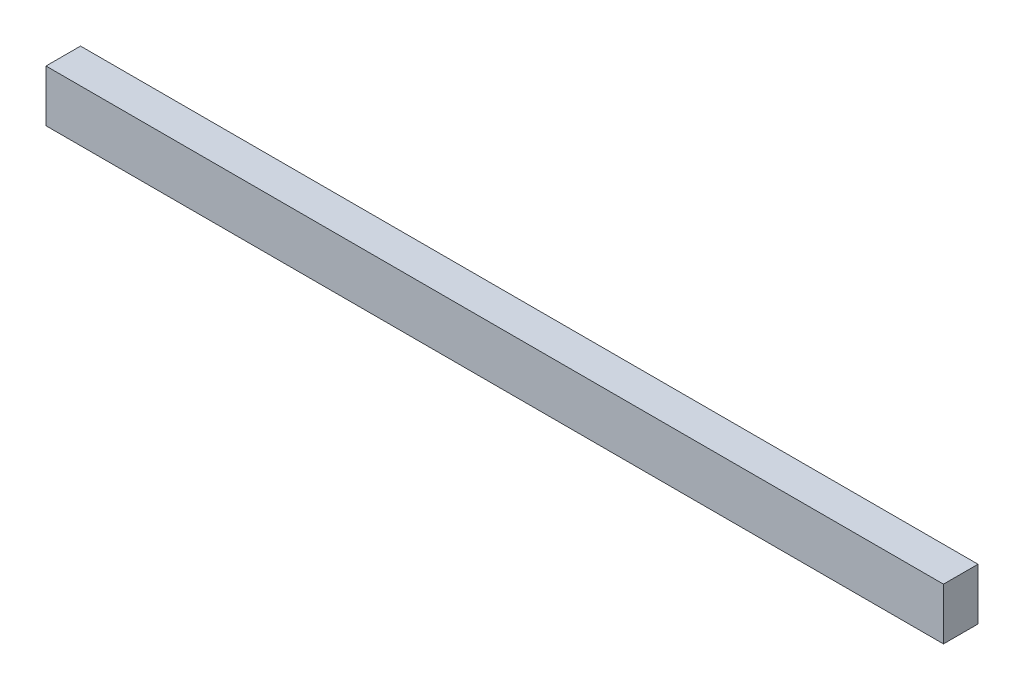
ISO-10303-21;
HEADER;
FILE_DESCRIPTION(('STEP AP214'),'2;1');
FILE_NAME('part.step','',(''),(''),'','','');
FILE_SCHEMA(('AUTOMOTIVE_DESIGN { 1 0 10303 214 1 1 1 1 }'));
ENDSEC;
DATA;
#1=APPLICATION_CONTEXT('core data for automotive mechanical design processes');
#2=APPLICATION_PROTOCOL_DEFINITION('international standard','automotive_design',2000,#1);
#3=PRODUCT_CONTEXT('',#1,'mechanical');
#4=PRODUCT('Part','Part','',(#3));
#5=PRODUCT_RELATED_PRODUCT_CATEGORY('part','',(#4));
#6=PRODUCT_DEFINITION_FORMATION('','',#4);
#7=PRODUCT_DEFINITION_CONTEXT('part definition',#1,'design');
#8=PRODUCT_DEFINITION('design','',#6,#7);
#9=PRODUCT_DEFINITION_SHAPE('','',#8);
#10=(LENGTH_UNIT() NAMED_UNIT(*) SI_UNIT(.MILLI.,.METRE.));
#11=(NAMED_UNIT(*) PLANE_ANGLE_UNIT() SI_UNIT($,.RADIAN.));
#12=(NAMED_UNIT(*) SI_UNIT($,.STERADIAN.) SOLID_ANGLE_UNIT());
#13=UNCERTAINTY_MEASURE_WITH_UNIT(LENGTH_MEASURE(1.E-05),#10,'distance_accuracy_value','');
#14=(GEOMETRIC_REPRESENTATION_CONTEXT(3) GLOBAL_UNCERTAINTY_ASSIGNED_CONTEXT((#13)) GLOBAL_UNIT_ASSIGNED_CONTEXT((#10,
#11,#12)) REPRESENTATION_CONTEXT('',''));
#15=CARTESIAN_POINT('',(0.,0.,0.));
#16=DIRECTION('',(0.,0.,1.));
#17=DIRECTION('',(1.,0.,0.));
#18=AXIS2_PLACEMENT_3D('',#15,#16,#17);
#19=CARTESIAN_POINT('',(0.,1.5,1.));
#20=DIRECTION('',(0.,1.,0.));
#21=DIRECTION('',(0.,0.,1.));
#22=AXIS2_PLACEMENT_3D('',#19,#20,#21);
#23=PLANE('',#22);
#24=DIRECTION('',(1.,0.,0.));
#25=VECTOR('',#24,1.);
#26=CARTESIAN_POINT('',(0.,1.5,0.));
#27=LINE('',#26,#25);
#28=CARTESIAN_POINT('',(0.,1.5,0.));
#29=VERTEX_POINT('',#28);
#30=CARTESIAN_POINT('',(26.,1.5,0.));
#31=VERTEX_POINT('',#30);
#32=EDGE_CURVE('E110',#29,#31,#27,.T.);
#33=ORIENTED_EDGE('',*,*,#32,.F.);
#34=DIRECTION('',(0.,0.,-1.));
#35=VECTOR('',#34,1.);
#36=CARTESIAN_POINT('',(0.,1.5,1.));
#37=LINE('',#36,#35);
#38=CARTESIAN_POINT('',(0.,1.5,1.));
#39=VERTEX_POINT('',#38);
#40=EDGE_CURVE('E11',#39,#29,#37,.T.);
#41=ORIENTED_EDGE('',*,*,#40,.F.);
#42=DIRECTION('',(1.,0.,0.));
#43=VECTOR('',#42,1.);
#44=CARTESIAN_POINT('',(0.,1.5,1.));
#45=LINE('',#44,#43);
#46=CARTESIAN_POINT('',(26.,1.5,1.));
#47=VERTEX_POINT('',#46);
#48=EDGE_CURVE('E102',#39,#47,#45,.T.);
#49=ORIENTED_EDGE('',*,*,#48,.T.);
#50=DIRECTION('',(0.,0.,-1.));
#51=VECTOR('',#50,1.);
#52=CARTESIAN_POINT('',(26.,1.5,1.));
#53=LINE('',#52,#51);
#54=EDGE_CURVE('E41',#47,#31,#53,.T.);
#55=ORIENTED_EDGE('',*,*,#54,.T.);
#56=EDGE_LOOP('',(#33,#41,#49,#55));
#57=FACE_BOUND('',#56,.T.);
#58=ADVANCED_FACE('F38',(#57),#23,.T.);
#59=CARTESIAN_POINT('',(0.,0.,1.));
#60=DIRECTION('',(-1.,0.,0.));
#61=DIRECTION('',(0.,0.,1.));
#62=AXIS2_PLACEMENT_3D('',#59,#60,#61);
#63=PLANE('',#62);
#64=DIRECTION('',(0.,1.,0.));
#65=VECTOR('',#64,1.);
#66=CARTESIAN_POINT('',(0.,0.,0.));
#67=LINE('',#66,#65);
#68=CARTESIAN_POINT('',(0.,0.,0.));
#69=VERTEX_POINT('',#68);
#70=EDGE_CURVE('E105',#69,#29,#67,.T.);
#71=ORIENTED_EDGE('',*,*,#70,.F.);
#72=DIRECTION('',(0.,0.,-1.));
#73=VECTOR('',#72,1.);
#74=CARTESIAN_POINT('',(0.,0.,1.));
#75=LINE('',#74,#73);
#76=CARTESIAN_POINT('',(0.,0.,1.));
#77=VERTEX_POINT('',#76);
#78=EDGE_CURVE('E48',#77,#69,#75,.T.);
#79=ORIENTED_EDGE('',*,*,#78,.F.);
#80=DIRECTION('',(0.,1.,0.));
#81=VECTOR('',#80,1.);
#82=CARTESIAN_POINT('',(0.,0.,1.));
#83=LINE('',#82,#81);
#84=EDGE_CURVE('E91',#77,#39,#83,.T.);
#85=ORIENTED_EDGE('',*,*,#84,.T.);
#86=ORIENTED_EDGE('',*,*,#40,.T.);
#87=EDGE_LOOP('',(#71,#79,#85,#86));
#88=FACE_BOUND('',#87,.T.);
#89=ADVANCED_FACE('F124',(#88),#63,.T.);
#90=CARTESIAN_POINT('',(0.,0.,1.));
#91=DIRECTION('',(0.,1.,0.));
#92=DIRECTION('',(0.,0.,1.));
#93=AXIS2_PLACEMENT_3D('',#90,#91,#92);
#94=PLANE('',#93);
#95=DIRECTION('',(1.,0.,0.));
#96=VECTOR('',#95,1.);
#97=CARTESIAN_POINT('',(0.,0.,0.));
#98=LINE('',#97,#96);
#99=CARTESIAN_POINT('',(26.,0.,0.));
#100=VERTEX_POINT('',#99);
#101=EDGE_CURVE('E97',#69,#100,#98,.T.);
#102=ORIENTED_EDGE('',*,*,#101,.T.);
#103=DIRECTION('',(0.,0.,-1.));
#104=VECTOR('',#103,1.);
#105=CARTESIAN_POINT('',(26.,0.,1.));
#106=LINE('',#105,#104);
#107=CARTESIAN_POINT('',(26.,0.,1.));
#108=VERTEX_POINT('',#107);
#109=EDGE_CURVE('E95',#108,#100,#106,.T.);
#110=ORIENTED_EDGE('',*,*,#109,.F.);
#111=DIRECTION('',(1.,0.,0.));
#112=VECTOR('',#111,1.);
#113=CARTESIAN_POINT('',(0.,0.,1.));
#114=LINE('',#113,#112);
#115=EDGE_CURVE('E88',#77,#108,#114,.T.);
#116=ORIENTED_EDGE('',*,*,#115,.F.);
#117=ORIENTED_EDGE('',*,*,#78,.T.);
#118=EDGE_LOOP('',(#102,#110,#116,#117));
#119=FACE_BOUND('',#118,.T.);
#120=ADVANCED_FACE('F96',(#119),#94,.F.);
#121=CARTESIAN_POINT('',(26.,0.,1.));
#122=DIRECTION('',(-1.,0.,0.));
#123=DIRECTION('',(0.,0.,1.));
#124=AXIS2_PLACEMENT_3D('',#121,#122,#123);
#125=PLANE('',#124);
#126=DIRECTION('',(0.,1.,0.));
#127=VECTOR('',#126,1.);
#128=CARTESIAN_POINT('',(26.,0.,0.));
#129=LINE('',#128,#127);
#130=EDGE_CURVE('E114',#100,#31,#129,.T.);
#131=ORIENTED_EDGE('',*,*,#130,.T.);
#132=ORIENTED_EDGE('',*,*,#54,.F.);
#133=DIRECTION('',(0.,1.,0.));
#134=VECTOR('',#133,1.);
#135=CARTESIAN_POINT('',(26.,0.,1.));
#136=LINE('',#135,#134);
#137=EDGE_CURVE('E85',#108,#47,#136,.T.);
#138=ORIENTED_EDGE('',*,*,#137,.F.);
#139=ORIENTED_EDGE('',*,*,#109,.T.);
#140=EDGE_LOOP('',(#131,#132,#138,#139));
#141=FACE_BOUND('',#140,.T.);
#142=ADVANCED_FACE('F101',(#141),#125,.F.);
#143=CARTESIAN_POINT('',(0.,0.,1.));
#144=DIRECTION('',(0.,0.,1.));
#145=DIRECTION('',(1.,0.,0.));
#146=AXIS2_PLACEMENT_3D('',#143,#144,#145);
#147=PLANE('',#146);
#148=ORIENTED_EDGE('',*,*,#48,.F.);
#149=ORIENTED_EDGE('',*,*,#84,.F.);
#150=ORIENTED_EDGE('',*,*,#115,.T.);
#151=ORIENTED_EDGE('',*,*,#137,.T.);
#152=EDGE_LOOP('',(#148,#149,#150,#151));
#153=FACE_BOUND('',#152,.T.);
#154=ADVANCED_FACE('F90',(#153),#147,.T.);
#155=CARTESIAN_POINT('',(0.,0.,0.));
#156=DIRECTION('',(0.,0.,1.));
#157=DIRECTION('',(1.,0.,0.));
#158=AXIS2_PLACEMENT_3D('',#155,#156,#157);
#159=PLANE('',#158);
#160=ORIENTED_EDGE('',*,*,#32,.T.);
#161=ORIENTED_EDGE('',*,*,#130,.F.);
#162=ORIENTED_EDGE('',*,*,#101,.F.);
#163=ORIENTED_EDGE('',*,*,#70,.T.);
#164=EDGE_LOOP('',(#160,#161,#162,#163));
#165=FACE_BOUND('',#164,.T.);
#166=ADVANCED_FACE('F123',(#165),#159,.F.);
#167=CLOSED_SHELL('',(#58,#89,#120,#142,#154,#166));
#168=MANIFOLD_SOLID_BREP('B2',#167);
#169=ADVANCED_BREP_SHAPE_REPRESENTATION('',(#18,#168),#14);
#170=SHAPE_DEFINITION_REPRESENTATION(#9,#169);
ENDSEC;
END-ISO-10303-21;
